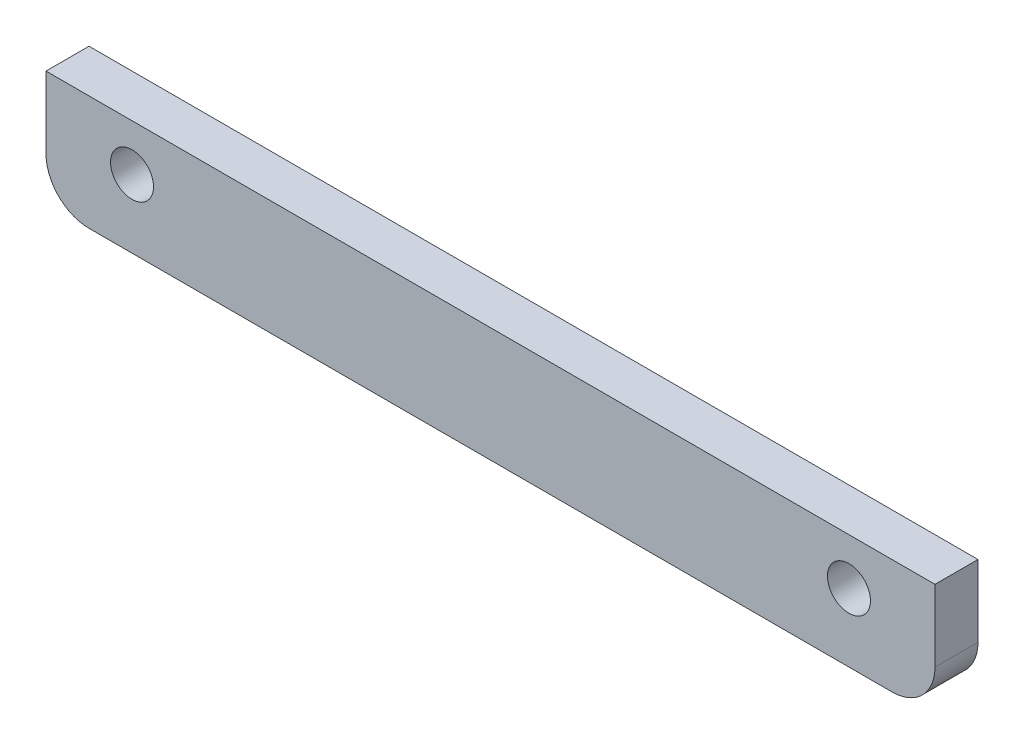
ISO-10303-21;
HEADER;
FILE_DESCRIPTION(('STEP AP214'),'2;1');
FILE_NAME('part.step','',(''),(''),'','','');
FILE_SCHEMA(('AUTOMOTIVE_DESIGN { 1 0 10303 214 1 1 1 1 }'));
ENDSEC;
DATA;
#1=APPLICATION_CONTEXT('core data for automotive mechanical design processes');
#2=APPLICATION_PROTOCOL_DEFINITION('international standard','automotive_design',2000,#1);
#3=PRODUCT_CONTEXT('',#1,'mechanical');
#4=PRODUCT('Part','Part','',(#3));
#5=PRODUCT_RELATED_PRODUCT_CATEGORY('part','',(#4));
#6=PRODUCT_DEFINITION_FORMATION('','',#4);
#7=PRODUCT_DEFINITION_CONTEXT('part definition',#1,'design');
#8=PRODUCT_DEFINITION('design','',#6,#7);
#9=PRODUCT_DEFINITION_SHAPE('','',#8);
#10=(LENGTH_UNIT() NAMED_UNIT(*) SI_UNIT(.MILLI.,.METRE.));
#11=(NAMED_UNIT(*) PLANE_ANGLE_UNIT() SI_UNIT($,.RADIAN.));
#12=(NAMED_UNIT(*) SI_UNIT($,.STERADIAN.) SOLID_ANGLE_UNIT());
#13=UNCERTAINTY_MEASURE_WITH_UNIT(LENGTH_MEASURE(1.E-05),#10,'distance_accuracy_value','');
#14=(GEOMETRIC_REPRESENTATION_CONTEXT(3) GLOBAL_UNCERTAINTY_ASSIGNED_CONTEXT((#13)) GLOBAL_UNIT_ASSIGNED_CONTEXT((#10,
#11,#12)) REPRESENTATION_CONTEXT('',''));
#15=CARTESIAN_POINT('',(0.,0.,0.));
#16=DIRECTION('',(0.,0.,1.));
#17=DIRECTION('',(1.,0.,0.));
#18=AXIS2_PLACEMENT_3D('',#15,#16,#17);
#19=CARTESIAN_POINT('',(-28.,-2.5,3.));
#20=DIRECTION('',(0.,0.,1.));
#21=DIRECTION('',(1.,0.,0.));
#22=AXIS2_PLACEMENT_3D('',#19,#20,#21);
#23=PLANE('',#22);
#24=CARTESIAN_POINT('',(-25.,-0.750000000000292,3.));
#25=DIRECTION('',(0.,0.,1.));
#26=DIRECTION('',(1.,0.,0.));
#27=AXIS2_PLACEMENT_3D('',#24,#25,#26);
#28=CIRCLE('',#27,1.5);
#29=CARTESIAN_POINT('',(-23.5,-0.750000000000292,3.));
#30=VERTEX_POINT('',#29);
#31=EDGE_CURVE('E121',#30,#30,#28,.T.);
#32=ORIENTED_EDGE('',*,*,#31,.F.);
#33=EDGE_LOOP('',(#32));
#34=FACE_BOUND('',#33,.T.);
#35=DIRECTION('',(0.,-1.,0.));
#36=VECTOR('',#35,1.);
#37=CARTESIAN_POINT('',(-31.,2.5,3.));
#38=LINE('',#37,#36);
#39=CARTESIAN_POINT('',(-31.,2.5,3.));
#40=VERTEX_POINT('',#39);
#41=CARTESIAN_POINT('',(-31.,-2.5,3.));
#42=VERTEX_POINT('',#41);
#43=EDGE_CURVE('E128',#40,#42,#38,.T.);
#44=ORIENTED_EDGE('',*,*,#43,.T.);
#45=CARTESIAN_POINT('',(-28.,-2.5,3.));
#46=DIRECTION('',(0.,0.,1.));
#47=DIRECTION('',(1.,0.,0.));
#48=AXIS2_PLACEMENT_3D('',#45,#46,#47);
#49=CIRCLE('',#48,3.);
#50=CARTESIAN_POINT('',(-28.,-5.5,3.));
#51=VERTEX_POINT('',#50);
#52=EDGE_CURVE('E86',#42,#51,#49,.T.);
#53=ORIENTED_EDGE('',*,*,#52,.T.);
#54=DIRECTION('',(1.,0.,0.));
#55=VECTOR('',#54,1.);
#56=CARTESIAN_POINT('',(-28.,-5.5,3.));
#57=LINE('',#56,#55);
#58=CARTESIAN_POINT('',(28.,-5.5,3.));
#59=VERTEX_POINT('',#58);
#60=EDGE_CURVE('E99',#51,#59,#57,.T.);
#61=ORIENTED_EDGE('',*,*,#60,.T.);
#62=CARTESIAN_POINT('',(28.,-2.5,3.));
#63=DIRECTION('',(0.,0.,1.));
#64=DIRECTION('',(1.,0.,0.));
#65=AXIS2_PLACEMENT_3D('',#62,#63,#64);
#66=CIRCLE('',#65,3.);
#67=CARTESIAN_POINT('',(31.,-2.5,3.));
#68=VERTEX_POINT('',#67);
#69=EDGE_CURVE('E93',#59,#68,#66,.T.);
#70=ORIENTED_EDGE('',*,*,#69,.T.);
#71=DIRECTION('',(0.,1.,0.));
#72=VECTOR('',#71,1.);
#73=CARTESIAN_POINT('',(31.,2.5,3.));
#74=LINE('',#73,#72);
#75=CARTESIAN_POINT('',(31.,2.5,3.));
#76=VERTEX_POINT('',#75);
#77=EDGE_CURVE('E97',#68,#76,#74,.T.);
#78=ORIENTED_EDGE('',*,*,#77,.T.);
#79=DIRECTION('',(-1.,0.,0.));
#80=VECTOR('',#79,1.);
#81=CARTESIAN_POINT('',(-31.,2.5,3.));
#82=LINE('',#81,#80);
#83=EDGE_CURVE('E49',#76,#40,#82,.T.);
#84=ORIENTED_EDGE('',*,*,#83,.T.);
#85=EDGE_LOOP('',(#44,#53,#61,#70,#78,#84));
#86=FACE_BOUND('',#85,.T.);
#87=CARTESIAN_POINT('',(25.,-0.75000000000029,3.));
#88=DIRECTION('',(0.,0.,1.));
#89=DIRECTION('',(1.,0.,0.));
#90=AXIS2_PLACEMENT_3D('',#87,#88,#89);
#91=CIRCLE('',#90,1.5);
#92=CARTESIAN_POINT('',(26.5,-0.75000000000029,3.));
#93=VERTEX_POINT('',#92);
#94=EDGE_CURVE('E170',#93,#93,#91,.T.);
#95=ORIENTED_EDGE('',*,*,#94,.F.);
#96=EDGE_LOOP('',(#95));
#97=FACE_BOUND('',#96,.T.);
#98=ADVANCED_FACE('F32',(#34,#86,#97),#23,.T.);
#99=CARTESIAN_POINT('',(-28.,-2.5,0.));
#100=DIRECTION('',(0.,0.,1.));
#101=DIRECTION('',(1.,0.,0.));
#102=AXIS2_PLACEMENT_3D('',#99,#100,#101);
#103=PLANE('',#102);
#104=DIRECTION('',(0.,-1.,0.));
#105=VECTOR('',#104,1.);
#106=CARTESIAN_POINT('',(-31.,2.5,0.));
#107=LINE('',#106,#105);
#108=CARTESIAN_POINT('',(-31.,2.5,0.));
#109=VERTEX_POINT('',#108);
#110=CARTESIAN_POINT('',(-31.,-2.5,0.));
#111=VERTEX_POINT('',#110);
#112=EDGE_CURVE('E117',#109,#111,#107,.T.);
#113=ORIENTED_EDGE('',*,*,#112,.F.);
#114=DIRECTION('',(-1.,0.,0.));
#115=VECTOR('',#114,1.);
#116=CARTESIAN_POINT('',(-31.,2.5,0.));
#117=LINE('',#116,#115);
#118=CARTESIAN_POINT('',(31.,2.5,0.));
#119=VERTEX_POINT('',#118);
#120=EDGE_CURVE('E78',#119,#109,#117,.T.);
#121=ORIENTED_EDGE('',*,*,#120,.F.);
#122=DIRECTION('',(0.,1.,0.));
#123=VECTOR('',#122,1.);
#124=CARTESIAN_POINT('',(31.,2.5,0.));
#125=LINE('',#124,#123);
#126=CARTESIAN_POINT('',(31.,-2.5,0.));
#127=VERTEX_POINT('',#126);
#128=EDGE_CURVE('E72',#127,#119,#125,.T.);
#129=ORIENTED_EDGE('',*,*,#128,.F.);
#130=CARTESIAN_POINT('',(28.,-2.5,0.));
#131=DIRECTION('',(0.,0.,1.));
#132=DIRECTION('',(1.,0.,0.));
#133=AXIS2_PLACEMENT_3D('',#130,#131,#132);
#134=CIRCLE('',#133,3.);
#135=CARTESIAN_POINT('',(28.,-5.5,0.));
#136=VERTEX_POINT('',#135);
#137=EDGE_CURVE('E107',#136,#127,#134,.T.);
#138=ORIENTED_EDGE('',*,*,#137,.F.);
#139=DIRECTION('',(1.,0.,0.));
#140=VECTOR('',#139,1.);
#141=CARTESIAN_POINT('',(-28.,-5.5,0.));
#142=LINE('',#141,#140);
#143=CARTESIAN_POINT('',(-28.,-5.5,0.));
#144=VERTEX_POINT('',#143);
#145=EDGE_CURVE('E123',#144,#136,#142,.T.);
#146=ORIENTED_EDGE('',*,*,#145,.F.);
#147=CARTESIAN_POINT('',(-28.,-2.5,0.));
#148=DIRECTION('',(0.,0.,1.));
#149=DIRECTION('',(1.,0.,0.));
#150=AXIS2_PLACEMENT_3D('',#147,#148,#149);
#151=CIRCLE('',#150,3.);
#152=EDGE_CURVE('E120',#111,#144,#151,.T.);
#153=ORIENTED_EDGE('',*,*,#152,.F.);
#154=EDGE_LOOP('',(#113,#121,#129,#138,#146,#153));
#155=FACE_BOUND('',#154,.T.);
#156=CARTESIAN_POINT('',(-25.,-0.750000000000292,0.));
#157=DIRECTION('',(0.,0.,1.));
#158=DIRECTION('',(1.,0.,0.));
#159=AXIS2_PLACEMENT_3D('',#156,#157,#158);
#160=CIRCLE('',#159,1.5);
#161=CARTESIAN_POINT('',(-23.5,-0.750000000000292,0.));
#162=VERTEX_POINT('',#161);
#163=EDGE_CURVE('E176',#162,#162,#160,.T.);
#164=ORIENTED_EDGE('',*,*,#163,.T.);
#165=EDGE_LOOP('',(#164));
#166=FACE_BOUND('',#165,.T.);
#167=CARTESIAN_POINT('',(25.,-0.75000000000029,0.));
#168=DIRECTION('',(0.,0.,1.));
#169=DIRECTION('',(1.,0.,0.));
#170=AXIS2_PLACEMENT_3D('',#167,#168,#169);
#171=CIRCLE('',#170,1.5);
#172=CARTESIAN_POINT('',(26.5,-0.75000000000029,0.));
#173=VERTEX_POINT('',#172);
#174=EDGE_CURVE('E173',#173,#173,#171,.T.);
#175=ORIENTED_EDGE('',*,*,#174,.T.);
#176=EDGE_LOOP('',(#175));
#177=FACE_BOUND('',#176,.T.);
#178=ADVANCED_FACE('F137',(#155,#166,#177),#103,.F.);
#179=CARTESIAN_POINT('',(-31.,2.5,3.));
#180=DIRECTION('',(1.,0.,0.));
#181=DIRECTION('',(0.,0.,-1.));
#182=AXIS2_PLACEMENT_3D('',#179,#180,#181);
#183=PLANE('',#182);
#184=ORIENTED_EDGE('',*,*,#112,.T.);
#185=DIRECTION('',(0.,0.,-1.));
#186=VECTOR('',#185,1.);
#187=CARTESIAN_POINT('',(-31.,-2.5,3.));
#188=LINE('',#187,#186);
#189=EDGE_CURVE('E11',#42,#111,#188,.T.);
#190=ORIENTED_EDGE('',*,*,#189,.F.);
#191=ORIENTED_EDGE('',*,*,#43,.F.);
#192=DIRECTION('',(0.,0.,-1.));
#193=VECTOR('',#192,1.);
#194=CARTESIAN_POINT('',(-31.,2.5,3.));
#195=LINE('',#194,#193);
#196=EDGE_CURVE('E113',#40,#109,#195,.T.);
#197=ORIENTED_EDGE('',*,*,#196,.T.);
#198=EDGE_LOOP('',(#184,#190,#191,#197));
#199=FACE_BOUND('',#198,.T.);
#200=ADVANCED_FACE('F34',(#199),#183,.F.);
#201=CARTESIAN_POINT('',(-28.,-2.5,3.));
#202=DIRECTION('',(0.,0.,-1.));
#203=DIRECTION('',(-1.,0.,0.));
#204=AXIS2_PLACEMENT_3D('',#201,#202,#203);
#205=CYLINDRICAL_SURFACE('',#204,3.);
#206=ORIENTED_EDGE('',*,*,#152,.T.);
#207=DIRECTION('',(0.,0.,-1.));
#208=VECTOR('',#207,1.);
#209=CARTESIAN_POINT('',(-28.,-5.5,3.));
#210=LINE('',#209,#208);
#211=EDGE_CURVE('E41',#51,#144,#210,.T.);
#212=ORIENTED_EDGE('',*,*,#211,.F.);
#213=ORIENTED_EDGE('',*,*,#52,.F.);
#214=ORIENTED_EDGE('',*,*,#189,.T.);
#215=EDGE_LOOP('',(#206,#212,#213,#214));
#216=FACE_BOUND('',#215,.T.);
#217=ADVANCED_FACE('F217',(#216),#205,.T.);
#218=CARTESIAN_POINT('',(-28.,-5.5,3.));
#219=DIRECTION('',(0.,1.,0.));
#220=DIRECTION('',(0.,0.,1.));
#221=AXIS2_PLACEMENT_3D('',#218,#219,#220);
#222=PLANE('',#221);
#223=ORIENTED_EDGE('',*,*,#145,.T.);
#224=DIRECTION('',(0.,0.,-1.));
#225=VECTOR('',#224,1.);
#226=CARTESIAN_POINT('',(28.,-5.5,3.));
#227=LINE('',#226,#225);
#228=EDGE_CURVE('E108',#59,#136,#227,.T.);
#229=ORIENTED_EDGE('',*,*,#228,.F.);
#230=ORIENTED_EDGE('',*,*,#60,.F.);
#231=ORIENTED_EDGE('',*,*,#211,.T.);
#232=EDGE_LOOP('',(#223,#229,#230,#231));
#233=FACE_BOUND('',#232,.T.);
#234=ADVANCED_FACE('F134',(#233),#222,.F.);
#235=CARTESIAN_POINT('',(28.,-2.5,3.));
#236=DIRECTION('',(0.,0.,-1.));
#237=DIRECTION('',(-1.,0.,0.));
#238=AXIS2_PLACEMENT_3D('',#235,#236,#237);
#239=CYLINDRICAL_SURFACE('',#238,3.);
#240=ORIENTED_EDGE('',*,*,#137,.T.);
#241=DIRECTION('',(0.,0.,-1.));
#242=VECTOR('',#241,1.);
#243=CARTESIAN_POINT('',(31.,-2.5,3.));
#244=LINE('',#243,#242);
#245=EDGE_CURVE('E104',#68,#127,#244,.T.);
#246=ORIENTED_EDGE('',*,*,#245,.F.);
#247=ORIENTED_EDGE('',*,*,#69,.F.);
#248=ORIENTED_EDGE('',*,*,#228,.T.);
#249=EDGE_LOOP('',(#240,#246,#247,#248));
#250=FACE_BOUND('',#249,.T.);
#251=ADVANCED_FACE('F105',(#250),#239,.T.);
#252=CARTESIAN_POINT('',(31.,2.5,3.));
#253=DIRECTION('',(-1.,0.,0.));
#254=DIRECTION('',(0.,0.,1.));
#255=AXIS2_PLACEMENT_3D('',#252,#253,#254);
#256=PLANE('',#255);
#257=ORIENTED_EDGE('',*,*,#128,.T.);
#258=DIRECTION('',(0.,0.,-1.));
#259=VECTOR('',#258,1.);
#260=CARTESIAN_POINT('',(31.,2.5,3.));
#261=LINE('',#260,#259);
#262=EDGE_CURVE('E109',#76,#119,#261,.T.);
#263=ORIENTED_EDGE('',*,*,#262,.F.);
#264=ORIENTED_EDGE('',*,*,#77,.F.);
#265=ORIENTED_EDGE('',*,*,#245,.T.);
#266=EDGE_LOOP('',(#257,#263,#264,#265));
#267=FACE_BOUND('',#266,.T.);
#268=ADVANCED_FACE('F111',(#267),#256,.F.);
#269=CARTESIAN_POINT('',(-31.,2.5,3.));
#270=DIRECTION('',(0.,-1.,0.));
#271=DIRECTION('',(1.,0.,0.));
#272=AXIS2_PLACEMENT_3D('',#269,#270,#271);
#273=PLANE('',#272);
#274=ORIENTED_EDGE('',*,*,#120,.T.);
#275=ORIENTED_EDGE('',*,*,#196,.F.);
#276=ORIENTED_EDGE('',*,*,#83,.F.);
#277=ORIENTED_EDGE('',*,*,#262,.T.);
#278=EDGE_LOOP('',(#274,#275,#276,#277));
#279=FACE_BOUND('',#278,.T.);
#280=ADVANCED_FACE('F142',(#279),#273,.F.);
#281=CARTESIAN_POINT('',(-25.,-0.750000000000292,3.));
#282=DIRECTION('',(0.,0.,-1.));
#283=DIRECTION('',(-1.,0.,0.));
#284=AXIS2_PLACEMENT_3D('',#281,#282,#283);
#285=CYLINDRICAL_SURFACE('',#284,1.5);
#286=ORIENTED_EDGE('',*,*,#31,.T.);
#287=EDGE_LOOP('',(#286));
#288=FACE_BOUND('',#287,.T.);
#289=ORIENTED_EDGE('',*,*,#163,.F.);
#290=EDGE_LOOP('',(#289));
#291=FACE_BOUND('',#290,.T.);
#292=ADVANCED_FACE('F144',(#288,#291),#285,.F.);
#293=CARTESIAN_POINT('',(25.,-0.75000000000029,3.));
#294=DIRECTION('',(0.,0.,-1.));
#295=DIRECTION('',(-1.,0.,0.));
#296=AXIS2_PLACEMENT_3D('',#293,#294,#295);
#297=CYLINDRICAL_SURFACE('',#296,1.5);
#298=ORIENTED_EDGE('',*,*,#94,.T.);
#299=EDGE_LOOP('',(#298));
#300=FACE_BOUND('',#299,.T.);
#301=ORIENTED_EDGE('',*,*,#174,.F.);
#302=EDGE_LOOP('',(#301));
#303=FACE_BOUND('',#302,.T.);
#304=ADVANCED_FACE('F150',(#300,#303),#297,.F.);
#305=CLOSED_SHELL('',(#98,#178,#200,#217,#234,#251,#268,#280,#292,#304));
#306=MANIFOLD_SOLID_BREP('B2',#305);
#307=ADVANCED_BREP_SHAPE_REPRESENTATION('',(#18,#306),#14);
#308=SHAPE_DEFINITION_REPRESENTATION(#9,#307);
ENDSEC;
END-ISO-10303-21;
